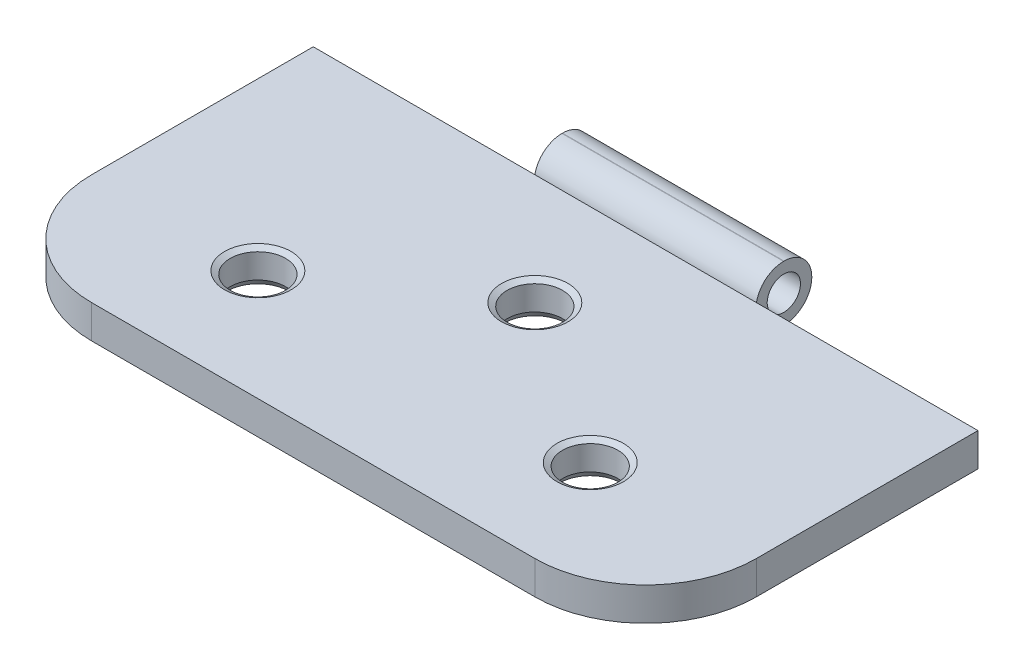
ISO-10303-21;
HEADER;
FILE_DESCRIPTION(('STEP AP214'),'2;1');
FILE_NAME('part.step','',(''),(''),'','','');
FILE_SCHEMA(('AUTOMOTIVE_DESIGN { 1 0 10303 214 1 1 1 1 }'));
ENDSEC;
DATA;
#1=APPLICATION_CONTEXT('core data for automotive mechanical design processes');
#2=APPLICATION_PROTOCOL_DEFINITION('international standard','automotive_design',2000,#1);
#3=PRODUCT_CONTEXT('',#1,'mechanical');
#4=PRODUCT('Part','Part','',(#3));
#5=PRODUCT_RELATED_PRODUCT_CATEGORY('part','',(#4));
#6=PRODUCT_DEFINITION_FORMATION('','',#4);
#7=PRODUCT_DEFINITION_CONTEXT('part definition',#1,'design');
#8=PRODUCT_DEFINITION('design','',#6,#7);
#9=PRODUCT_DEFINITION_SHAPE('','',#8);
#10=(LENGTH_UNIT() NAMED_UNIT(*) SI_UNIT(.MILLI.,.METRE.));
#11=(NAMED_UNIT(*) PLANE_ANGLE_UNIT() SI_UNIT($,.RADIAN.));
#12=(NAMED_UNIT(*) SI_UNIT($,.STERADIAN.) SOLID_ANGLE_UNIT());
#13=UNCERTAINTY_MEASURE_WITH_UNIT(LENGTH_MEASURE(1.E-05),#10,'distance_accuracy_value','');
#14=(GEOMETRIC_REPRESENTATION_CONTEXT(3) GLOBAL_UNCERTAINTY_ASSIGNED_CONTEXT((#13)) GLOBAL_UNIT_ASSIGNED_CONTEXT((#10,
#11,#12)) REPRESENTATION_CONTEXT('',''));
#15=CARTESIAN_POINT('',(0.,0.,0.));
#16=DIRECTION('',(0.,0.,1.));
#17=DIRECTION('',(1.,0.,0.));
#18=AXIS2_PLACEMENT_3D('',#15,#16,#17);
#19=CARTESIAN_POINT('',(-30.,3.,-15.));
#20=DIRECTION('',(0.,0.,1.));
#21=DIRECTION('',(1.,0.,0.));
#22=AXIS2_PLACEMENT_3D('',#19,#20,#21);
#23=PLANE('',#22);
#24=DIRECTION('',(0.,-1.,0.));
#25=VECTOR('',#24,1.);
#26=CARTESIAN_POINT('',(10.,0.,-15.));
#27=LINE('',#26,#25);
#28=CARTESIAN_POINT('',(10.,3.,-15.));
#29=VERTEX_POINT('',#28);
#30=CARTESIAN_POINT('',(9.99999999999999,0.,-15.));
#31=VERTEX_POINT('',#30);
#32=EDGE_CURVE('E126',#29,#31,#27,.T.);
#33=ORIENTED_EDGE('',*,*,#32,.F.);
#34=DIRECTION('',(-1.,0.,0.));
#35=VECTOR('',#34,1.);
#36=CARTESIAN_POINT('',(-30.,3.,-15.));
#37=LINE('',#36,#35);
#38=CARTESIAN_POINT('',(30.,3.,-15.));
#39=VERTEX_POINT('',#38);
#40=EDGE_CURVE('E132',#39,#29,#37,.T.);
#41=ORIENTED_EDGE('',*,*,#40,.F.);
#42=DIRECTION('',(0.,-1.,0.));
#43=VECTOR('',#42,1.);
#44=CARTESIAN_POINT('',(30.,3.,-15.));
#45=LINE('',#44,#43);
#46=CARTESIAN_POINT('',(30.,0.,-15.));
#47=VERTEX_POINT('',#46);
#48=EDGE_CURVE('E186',#39,#47,#45,.T.);
#49=ORIENTED_EDGE('',*,*,#48,.T.);
#50=DIRECTION('',(-1.,0.,0.));
#51=VECTOR('',#50,1.);
#52=CARTESIAN_POINT('',(-30.,0.,-15.));
#53=LINE('',#52,#51);
#54=EDGE_CURVE('E146',#47,#31,#53,.T.);
#55=ORIENTED_EDGE('',*,*,#54,.T.);
#56=EDGE_LOOP('',(#33,#41,#49,#55));
#57=FACE_BOUND('',#56,.T.);
#58=ADVANCED_FACE('F33',(#57),#23,.F.);
#59=DIRECTION('',(0.,1.,0.));
#60=VECTOR('',#59,1.);
#61=CARTESIAN_POINT('',(-9.99999999999999,0.,-15.));
#62=LINE('',#61,#60);
#63=CARTESIAN_POINT('',(-10.,0.,-15.));
#64=VERTEX_POINT('',#63);
#65=CARTESIAN_POINT('',(-9.99999999999999,3.,-15.));
#66=VERTEX_POINT('',#65);
#67=EDGE_CURVE('E147',#64,#66,#62,.T.);
#68=ORIENTED_EDGE('',*,*,#67,.F.);
#69=CARTESIAN_POINT('',(-30.,0.,-15.));
#70=VERTEX_POINT('',#69);
#71=EDGE_CURVE('E177',#64,#70,#53,.T.);
#72=ORIENTED_EDGE('',*,*,#71,.T.);
#73=DIRECTION('',(0.,-1.,0.));
#74=VECTOR('',#73,1.);
#75=CARTESIAN_POINT('',(-30.,3.,-15.));
#76=LINE('',#75,#74);
#77=CARTESIAN_POINT('',(-30.,3.,-15.));
#78=VERTEX_POINT('',#77);
#79=EDGE_CURVE('E175',#78,#70,#76,.T.);
#80=ORIENTED_EDGE('',*,*,#79,.F.);
#81=EDGE_CURVE('E142',#66,#78,#37,.T.);
#82=ORIENTED_EDGE('',*,*,#81,.F.);
#83=EDGE_LOOP('',(#68,#72,#80,#82));
#84=FACE_BOUND('',#83,.T.);
#85=ADVANCED_FACE('F278',(#84),#23,.F.);
#86=CARTESIAN_POINT('',(30.,3.,-15.));
#87=DIRECTION('',(-1.,0.,0.));
#88=DIRECTION('',(0.,0.,1.));
#89=AXIS2_PLACEMENT_3D('',#86,#87,#88);
#90=PLANE('',#89);
#91=DIRECTION('',(0.,0.,-1.));
#92=VECTOR('',#91,1.);
#93=CARTESIAN_POINT('',(30.,3.,-15.));
#94=LINE('',#93,#92);
#95=CARTESIAN_POINT('',(30.,3.,5.));
#96=VERTEX_POINT('',#95);
#97=EDGE_CURVE('E137',#96,#39,#94,.T.);
#98=ORIENTED_EDGE('',*,*,#97,.F.);
#99=DIRECTION('',(0.,-1.,0.));
#100=VECTOR('',#99,1.);
#101=CARTESIAN_POINT('',(30.,3.,5.));
#102=LINE('',#101,#100);
#103=CARTESIAN_POINT('',(30.,0.,5.));
#104=VERTEX_POINT('',#103);
#105=EDGE_CURVE('E203',#96,#104,#102,.T.);
#106=ORIENTED_EDGE('',*,*,#105,.T.);
#107=DIRECTION('',(0.,0.,-1.));
#108=VECTOR('',#107,1.);
#109=CARTESIAN_POINT('',(30.,0.,-15.));
#110=LINE('',#109,#108);
#111=EDGE_CURVE('E167',#104,#47,#110,.T.);
#112=ORIENTED_EDGE('',*,*,#111,.T.);
#113=ORIENTED_EDGE('',*,*,#48,.F.);
#114=EDGE_LOOP('',(#98,#106,#112,#113));
#115=FACE_BOUND('',#114,.T.);
#116=ADVANCED_FACE('F284',(#115),#90,.F.);
#117=CARTESIAN_POINT('',(-30.,3.,-15.));
#118=DIRECTION('',(1.,0.,0.));
#119=DIRECTION('',(0.,0.,-1.));
#120=AXIS2_PLACEMENT_3D('',#117,#118,#119);
#121=PLANE('',#120);
#122=DIRECTION('',(0.,0.,1.));
#123=VECTOR('',#122,1.);
#124=CARTESIAN_POINT('',(-30.,0.,-15.));
#125=LINE('',#124,#123);
#126=CARTESIAN_POINT('',(-30.,0.,5.));
#127=VERTEX_POINT('',#126);
#128=EDGE_CURVE('E179',#70,#127,#125,.T.);
#129=ORIENTED_EDGE('',*,*,#128,.T.);
#130=DIRECTION('',(0.,-1.,0.));
#131=VECTOR('',#130,1.);
#132=CARTESIAN_POINT('',(-30.,3.,5.));
#133=LINE('',#132,#131);
#134=CARTESIAN_POINT('',(-30.,3.,5.));
#135=VERTEX_POINT('',#134);
#136=EDGE_CURVE('E197',#127,#135,#133,.F.);
#137=ORIENTED_EDGE('',*,*,#136,.T.);
#138=DIRECTION('',(0.,0.,1.));
#139=VECTOR('',#138,1.);
#140=CARTESIAN_POINT('',(-30.,3.,-15.));
#141=LINE('',#140,#139);
#142=EDGE_CURVE('E141',#78,#135,#141,.T.);
#143=ORIENTED_EDGE('',*,*,#142,.F.);
#144=ORIENTED_EDGE('',*,*,#79,.T.);
#145=EDGE_LOOP('',(#129,#137,#143,#144));
#146=FACE_BOUND('',#145,.T.);
#147=ADVANCED_FACE('F288',(#146),#121,.F.);
#148=CARTESIAN_POINT('',(-30.,3.,15.));
#149=DIRECTION('',(0.,0.,-1.));
#150=DIRECTION('',(-1.,0.,0.));
#151=AXIS2_PLACEMENT_3D('',#148,#149,#150);
#152=PLANE('',#151);
#153=DIRECTION('',(1.,0.,0.));
#154=VECTOR('',#153,1.);
#155=CARTESIAN_POINT('',(-30.,3.,15.));
#156=LINE('',#155,#154);
#157=CARTESIAN_POINT('',(-20.,3.,15.));
#158=VERTEX_POINT('',#157);
#159=CARTESIAN_POINT('',(20.,3.,15.));
#160=VERTEX_POINT('',#159);
#161=EDGE_CURVE('E172',#158,#160,#156,.T.);
#162=ORIENTED_EDGE('',*,*,#161,.F.);
#163=DIRECTION('',(0.,-1.,0.));
#164=VECTOR('',#163,1.);
#165=CARTESIAN_POINT('',(-20.,3.,15.));
#166=LINE('',#165,#164);
#167=CARTESIAN_POINT('',(-20.,0.,15.));
#168=VERTEX_POINT('',#167);
#169=EDGE_CURVE('E190',#158,#168,#166,.T.);
#170=ORIENTED_EDGE('',*,*,#169,.T.);
#171=DIRECTION('',(1.,0.,0.));
#172=VECTOR('',#171,1.);
#173=CARTESIAN_POINT('',(-30.,0.,15.));
#174=LINE('',#173,#172);
#175=CARTESIAN_POINT('',(20.,0.,15.));
#176=VERTEX_POINT('',#175);
#177=EDGE_CURVE('E168',#168,#176,#174,.T.);
#178=ORIENTED_EDGE('',*,*,#177,.T.);
#179=DIRECTION('',(0.,-1.,0.));
#180=VECTOR('',#179,1.);
#181=CARTESIAN_POINT('',(20.,3.,15.));
#182=LINE('',#181,#180);
#183=EDGE_CURVE('E188',#176,#160,#182,.F.);
#184=ORIENTED_EDGE('',*,*,#183,.T.);
#185=EDGE_LOOP('',(#162,#170,#178,#184));
#186=FACE_BOUND('',#185,.T.);
#187=ADVANCED_FACE('F334',(#186),#152,.F.);
#188=CARTESIAN_POINT('',(0.,3.,0.));
#189=DIRECTION('',(0.,1.,0.));
#190=DIRECTION('',(0.,0.,1.));
#191=AXIS2_PLACEMENT_3D('',#188,#189,#190);
#192=PLANE('',#191);
#193=CARTESIAN_POINT('',(15.,3.,5.));
#194=DIRECTION('',(0.,1.,0.));
#195=DIRECTION('',(0.,0.,1.));
#196=AXIS2_PLACEMENT_3D('',#193,#194,#195);
#197=CIRCLE('',#196,3.00000000000002);
#198=CARTESIAN_POINT('',(15.,3.,8.00000000000001));
#199=VERTEX_POINT('',#198);
#200=EDGE_CURVE('E11',#199,#199,#197,.F.);
#201=ORIENTED_EDGE('',*,*,#200,.T.);
#202=EDGE_LOOP('',(#201));
#203=FACE_BOUND('',#202,.T.);
#204=CARTESIAN_POINT('',(-15.,3.,5.));
#205=DIRECTION('',(0.,1.,0.));
#206=DIRECTION('',(0.,0.,1.));
#207=AXIS2_PLACEMENT_3D('',#204,#205,#206);
#208=CIRCLE('',#207,3.00000000000002);
#209=CARTESIAN_POINT('',(-15.,3.,8.00000000000001));
#210=VERTEX_POINT('',#209);
#211=EDGE_CURVE('E41',#210,#210,#208,.F.);
#212=ORIENTED_EDGE('',*,*,#211,.T.);
#213=EDGE_LOOP('',(#212));
#214=FACE_BOUND('',#213,.T.);
#215=CARTESIAN_POINT('',(0.,3.,-5.));
#216=DIRECTION('',(0.,1.,0.));
#217=DIRECTION('',(0.,0.,1.));
#218=AXIS2_PLACEMENT_3D('',#215,#216,#217);
#219=CIRCLE('',#218,3.00000000000002);
#220=CARTESIAN_POINT('',(0.,3.,-1.99999999999999));
#221=VERTEX_POINT('',#220);
#222=EDGE_CURVE('E223',#221,#221,#219,.F.);
#223=ORIENTED_EDGE('',*,*,#222,.T.);
#224=EDGE_LOOP('',(#223));
#225=FACE_BOUND('',#224,.T.);
#226=DIRECTION('',(1.,0.,0.));
#227=VECTOR('',#226,1.);
#228=CARTESIAN_POINT('',(10.,3.,-15.));
#229=LINE('',#228,#227);
#230=EDGE_CURVE('E134',#66,#29,#229,.T.);
#231=ORIENTED_EDGE('',*,*,#230,.F.);
#232=ORIENTED_EDGE('',*,*,#81,.T.);
#233=ORIENTED_EDGE('',*,*,#142,.T.);
#234=CARTESIAN_POINT('',(-20.,3.,5.));
#235=DIRECTION('',(0.,1.,0.));
#236=DIRECTION('',(0.,0.,1.));
#237=AXIS2_PLACEMENT_3D('',#234,#235,#236);
#238=CIRCLE('',#237,10.);
#239=EDGE_CURVE('E201',#135,#158,#238,.T.);
#240=ORIENTED_EDGE('',*,*,#239,.T.);
#241=ORIENTED_EDGE('',*,*,#161,.T.);
#242=CARTESIAN_POINT('',(20.,3.,5.));
#243=DIRECTION('',(0.,1.,0.));
#244=DIRECTION('',(0.,0.,1.));
#245=AXIS2_PLACEMENT_3D('',#242,#243,#244);
#246=CIRCLE('',#245,10.);
#247=EDGE_CURVE('E199',#160,#96,#246,.T.);
#248=ORIENTED_EDGE('',*,*,#247,.T.);
#249=ORIENTED_EDGE('',*,*,#97,.T.);
#250=ORIENTED_EDGE('',*,*,#40,.T.);
#251=EDGE_LOOP('',(#231,#232,#233,#240,#241,#248,#249,#250));
#252=FACE_BOUND('',#251,.T.);
#253=ADVANCED_FACE('F133',(#203,#214,#225,#252),#192,.T.);
#254=CARTESIAN_POINT('',(0.,0.,0.));
#255=DIRECTION('',(0.,1.,0.));
#256=DIRECTION('',(0.,0.,1.));
#257=AXIS2_PLACEMENT_3D('',#254,#255,#256);
#258=PLANE('',#257);
#259=CARTESIAN_POINT('',(15.,0.,5.));
#260=DIRECTION('',(0.,1.,0.));
#261=DIRECTION('',(0.,0.,1.));
#262=AXIS2_PLACEMENT_3D('',#259,#260,#261);
#263=CIRCLE('',#262,2.78867513459482);
#264=CARTESIAN_POINT('',(15.,0.,7.78867513459482));
#265=VERTEX_POINT('',#264);
#266=EDGE_CURVE('E232',#265,#265,#263,.T.);
#267=ORIENTED_EDGE('',*,*,#266,.T.);
#268=EDGE_LOOP('',(#267));
#269=FACE_BOUND('',#268,.T.);
#270=CARTESIAN_POINT('',(0.,0.,-5.));
#271=DIRECTION('',(0.,1.,0.));
#272=DIRECTION('',(0.,0.,1.));
#273=AXIS2_PLACEMENT_3D('',#270,#271,#272);
#274=CIRCLE('',#273,2.78867513459482);
#275=CARTESIAN_POINT('',(0.,0.,-2.21132486540519));
#276=VERTEX_POINT('',#275);
#277=EDGE_CURVE('E229',#276,#276,#274,.T.);
#278=ORIENTED_EDGE('',*,*,#277,.T.);
#279=EDGE_LOOP('',(#278));
#280=FACE_BOUND('',#279,.T.);
#281=CARTESIAN_POINT('',(-15.,0.,5.));
#282=DIRECTION('',(0.,1.,0.));
#283=DIRECTION('',(0.,0.,1.));
#284=AXIS2_PLACEMENT_3D('',#281,#282,#283);
#285=CIRCLE('',#284,2.78867513459482);
#286=CARTESIAN_POINT('',(-15.,0.,7.78867513459482));
#287=VERTEX_POINT('',#286);
#288=EDGE_CURVE('E226',#287,#287,#285,.T.);
#289=ORIENTED_EDGE('',*,*,#288,.T.);
#290=EDGE_LOOP('',(#289));
#291=FACE_BOUND('',#290,.T.);
#292=DIRECTION('',(0.,0.,1.));
#293=VECTOR('',#292,1.);
#294=CARTESIAN_POINT('',(-9.99999999999999,0.,-20.));
#295=LINE('',#294,#293);
#296=CARTESIAN_POINT('',(-9.99999999999999,0.,-17.5));
#297=VERTEX_POINT('',#296);
#298=EDGE_CURVE('E163',#297,#64,#295,.T.);
#299=ORIENTED_EDGE('',*,*,#298,.F.);
#300=DIRECTION('',(-1.,0.,0.));
#301=VECTOR('',#300,1.);
#302=CARTESIAN_POINT('',(0.,0.,-17.5));
#303=LINE('',#302,#301);
#304=CARTESIAN_POINT('',(10.,0.,-17.5));
#305=VERTEX_POINT('',#304);
#306=EDGE_CURVE('E128',#297,#305,#303,.F.);
#307=ORIENTED_EDGE('',*,*,#306,.T.);
#308=DIRECTION('',(0.,0.,1.));
#309=VECTOR('',#308,1.);
#310=CARTESIAN_POINT('',(10.,0.,-20.));
#311=LINE('',#310,#309);
#312=EDGE_CURVE('E165',#305,#31,#311,.T.);
#313=ORIENTED_EDGE('',*,*,#312,.T.);
#314=ORIENTED_EDGE('',*,*,#54,.F.);
#315=ORIENTED_EDGE('',*,*,#111,.F.);
#316=CARTESIAN_POINT('',(20.,0.,5.));
#317=DIRECTION('',(0.,1.,0.));
#318=DIRECTION('',(0.,0.,1.));
#319=AXIS2_PLACEMENT_3D('',#316,#317,#318);
#320=CIRCLE('',#319,10.);
#321=EDGE_CURVE('E193',#104,#176,#320,.F.);
#322=ORIENTED_EDGE('',*,*,#321,.T.);
#323=ORIENTED_EDGE('',*,*,#177,.F.);
#324=CARTESIAN_POINT('',(-20.,0.,5.));
#325=DIRECTION('',(0.,1.,0.));
#326=DIRECTION('',(0.,0.,1.));
#327=AXIS2_PLACEMENT_3D('',#324,#325,#326);
#328=CIRCLE('',#327,10.);
#329=EDGE_CURVE('E195',#168,#127,#328,.F.);
#330=ORIENTED_EDGE('',*,*,#329,.T.);
#331=ORIENTED_EDGE('',*,*,#128,.F.);
#332=ORIENTED_EDGE('',*,*,#71,.F.);
#333=EDGE_LOOP('',(#299,#307,#313,#314,#315,#322,#323,#330,#331,#332));
#334=FACE_BOUND('',#333,.T.);
#335=ADVANCED_FACE('F333',(#269,#280,#291,#334),#258,.F.);
#336=CARTESIAN_POINT('',(0.,-2.,-5.));
#337=DIRECTION('',(0.,1.,0.));
#338=DIRECTION('',(0.,0.,1.));
#339=AXIS2_PLACEMENT_3D('',#336,#337,#338);
#340=CYLINDRICAL_SURFACE('',#339,2.5);
#341=CARTESIAN_POINT('',(0.,0.500000000000004,-5.));
#342=DIRECTION('',(0.,1.,0.));
#343=DIRECTION('',(0.,0.,1.));
#344=AXIS2_PLACEMENT_3D('',#341,#342,#343);
#345=CIRCLE('',#344,2.5);
#346=CARTESIAN_POINT('',(0.,0.500000000000004,-2.5));
#347=VERTEX_POINT('',#346);
#348=EDGE_CURVE('E241',#347,#347,#345,.F.);
#349=ORIENTED_EDGE('',*,*,#348,.T.);
#350=EDGE_LOOP('',(#349));
#351=FACE_BOUND('',#350,.T.);
#352=CARTESIAN_POINT('',(0.,2.71132486540518,-5.));
#353=DIRECTION('',(0.,1.,0.));
#354=DIRECTION('',(0.,0.,1.));
#355=AXIS2_PLACEMENT_3D('',#352,#353,#354);
#356=CIRCLE('',#355,2.5);
#357=CARTESIAN_POINT('',(0.,2.71132486540518,-2.5));
#358=VERTEX_POINT('',#357);
#359=EDGE_CURVE('E219',#358,#358,#356,.T.);
#360=ORIENTED_EDGE('',*,*,#359,.T.);
#361=EDGE_LOOP('',(#360));
#362=FACE_BOUND('',#361,.T.);
#363=ADVANCED_FACE('F273',(#351,#362),#340,.F.);
#364=CARTESIAN_POINT('',(15.,-2.,5.));
#365=DIRECTION('',(0.,1.,0.));
#366=DIRECTION('',(0.,0.,1.));
#367=AXIS2_PLACEMENT_3D('',#364,#365,#366);
#368=CYLINDRICAL_SURFACE('',#367,2.5);
#369=CARTESIAN_POINT('',(15.,0.500000000000004,5.));
#370=DIRECTION('',(0.,1.,0.));
#371=DIRECTION('',(0.,0.,1.));
#372=AXIS2_PLACEMENT_3D('',#369,#370,#371);
#373=CIRCLE('',#372,2.5);
#374=CARTESIAN_POINT('',(15.,0.500000000000004,7.5));
#375=VERTEX_POINT('',#374);
#376=EDGE_CURVE('E238',#375,#375,#373,.F.);
#377=ORIENTED_EDGE('',*,*,#376,.T.);
#378=EDGE_LOOP('',(#377));
#379=FACE_BOUND('',#378,.T.);
#380=CARTESIAN_POINT('',(15.,2.71132486540518,5.));
#381=DIRECTION('',(0.,1.,0.));
#382=DIRECTION('',(0.,0.,1.));
#383=AXIS2_PLACEMENT_3D('',#380,#381,#382);
#384=CIRCLE('',#383,2.5);
#385=CARTESIAN_POINT('',(15.,2.71132486540518,7.5));
#386=VERTEX_POINT('',#385);
#387=EDGE_CURVE('E235',#386,#386,#384,.T.);
#388=ORIENTED_EDGE('',*,*,#387,.T.);
#389=EDGE_LOOP('',(#388));
#390=FACE_BOUND('',#389,.T.);
#391=ADVANCED_FACE('F262',(#379,#390),#368,.F.);
#392=CARTESIAN_POINT('',(-15.,-2.,5.));
#393=DIRECTION('',(0.,1.,0.));
#394=DIRECTION('',(0.,0.,1.));
#395=AXIS2_PLACEMENT_3D('',#392,#393,#394);
#396=CYLINDRICAL_SURFACE('',#395,2.5);
#397=CARTESIAN_POINT('',(-15.,0.500000000000004,5.));
#398=DIRECTION('',(0.,1.,0.));
#399=DIRECTION('',(0.,0.,1.));
#400=AXIS2_PLACEMENT_3D('',#397,#398,#399);
#401=CIRCLE('',#400,2.5);
#402=CARTESIAN_POINT('',(-15.,0.500000000000004,7.5));
#403=VERTEX_POINT('',#402);
#404=EDGE_CURVE('E247',#403,#403,#401,.F.);
#405=ORIENTED_EDGE('',*,*,#404,.T.);
#406=EDGE_LOOP('',(#405));
#407=FACE_BOUND('',#406,.T.);
#408=CARTESIAN_POINT('',(-15.,2.71132486540518,5.));
#409=DIRECTION('',(0.,1.,0.));
#410=DIRECTION('',(0.,0.,1.));
#411=AXIS2_PLACEMENT_3D('',#408,#409,#410);
#412=CIRCLE('',#411,2.5);
#413=CARTESIAN_POINT('',(-15.,2.71132486540518,7.5));
#414=VERTEX_POINT('',#413);
#415=EDGE_CURVE('E244',#414,#414,#412,.T.);
#416=ORIENTED_EDGE('',*,*,#415,.T.);
#417=EDGE_LOOP('',(#416));
#418=FACE_BOUND('',#417,.T.);
#419=ADVANCED_FACE('F259',(#407,#418),#396,.F.);
#420=CARTESIAN_POINT('',(-20.,3.,5.));
#421=DIRECTION('',(0.,-1.,0.));
#422=DIRECTION('',(0.,0.,-1.));
#423=AXIS2_PLACEMENT_3D('',#420,#421,#422);
#424=CYLINDRICAL_SURFACE('',#423,10.);
#425=ORIENTED_EDGE('',*,*,#239,.F.);
#426=ORIENTED_EDGE('',*,*,#136,.F.);
#427=ORIENTED_EDGE('',*,*,#329,.F.);
#428=ORIENTED_EDGE('',*,*,#169,.F.);
#429=EDGE_LOOP('',(#425,#426,#427,#428));
#430=FACE_BOUND('',#429,.T.);
#431=ADVANCED_FACE('F261',(#430),#424,.T.);
#432=CARTESIAN_POINT('',(20.,3.,5.));
#433=DIRECTION('',(0.,-1.,0.));
#434=DIRECTION('',(0.,0.,-1.));
#435=AXIS2_PLACEMENT_3D('',#432,#433,#434);
#436=CYLINDRICAL_SURFACE('',#435,10.);
#437=ORIENTED_EDGE('',*,*,#247,.F.);
#438=ORIENTED_EDGE('',*,*,#183,.F.);
#439=ORIENTED_EDGE('',*,*,#321,.F.);
#440=ORIENTED_EDGE('',*,*,#105,.F.);
#441=EDGE_LOOP('',(#437,#438,#439,#440));
#442=FACE_BOUND('',#441,.T.);
#443=ADVANCED_FACE('F270',(#442),#436,.T.);
#444=CARTESIAN_POINT('',(10.,0.,-20.));
#445=DIRECTION('',(-1.,0.,0.));
#446=DIRECTION('',(0.,0.,1.));
#447=AXIS2_PLACEMENT_3D('',#444,#445,#446);
#448=PLANE('',#447);
#449=CARTESIAN_POINT('',(10.,2.5,-17.4747448713916));
#450=DIRECTION('',(1.,0.,0.));
#451=DIRECTION('',(0.,0.,-1.));
#452=AXIS2_PLACEMENT_3D('',#449,#450,#451);
#453=CIRCLE('',#452,1.5);
#454=CARTESIAN_POINT('',(10.,2.5,-18.9747448713916));
#455=VERTEX_POINT('',#454);
#456=EDGE_CURVE('E550',#455,#455,#453,.T.);
#457=ORIENTED_EDGE('',*,*,#456,.F.);
#458=EDGE_LOOP('',(#457));
#459=FACE_BOUND('',#458,.T.);
#460=ORIENTED_EDGE('',*,*,#312,.F.);
#461=CARTESIAN_POINT('',(10.,2.5,-17.5));
#462=DIRECTION('',(-1.,0.,0.));
#463=DIRECTION('',(0.,0.,1.));
#464=AXIS2_PLACEMENT_3D('',#461,#462,#463);
#465=CIRCLE('',#464,2.5);
#466=CARTESIAN_POINT('',(10.,2.5,-20.));
#467=VERTEX_POINT('',#466);
#468=EDGE_CURVE('E214',#305,#467,#465,.F.);
#469=ORIENTED_EDGE('',*,*,#468,.T.);
#470=CARTESIAN_POINT('',(10.,2.5,-17.5));
#471=DIRECTION('',(-1.,0.,0.));
#472=DIRECTION('',(0.,0.,1.));
#473=AXIS2_PLACEMENT_3D('',#470,#471,#472);
#474=CIRCLE('',#473,2.5);
#475=CARTESIAN_POINT('',(10.,5.,-17.5));
#476=VERTEX_POINT('',#475);
#477=EDGE_CURVE('E48',#467,#476,#474,.F.);
#478=ORIENTED_EDGE('',*,*,#477,.T.);
#479=DIRECTION('',(0.,0.,-1.));
#480=VECTOR('',#479,1.);
#481=CARTESIAN_POINT('',(10.,5.,-20.));
#482=LINE('',#481,#480);
#483=CARTESIAN_POINT('',(10.,5.,-17.4494897427832));
#484=VERTEX_POINT('',#483);
#485=EDGE_CURVE('E127',#484,#476,#482,.T.);
#486=ORIENTED_EDGE('',*,*,#485,.F.);
#487=CARTESIAN_POINT('',(10.,2.5,-17.4494897427832));
#488=DIRECTION('',(-1.,0.,0.));
#489=DIRECTION('',(0.,0.,1.));
#490=AXIS2_PLACEMENT_3D('',#487,#488,#489);
#491=CIRCLE('',#490,2.5);
#492=EDGE_CURVE('E56',#484,#29,#491,.F.);
#493=ORIENTED_EDGE('',*,*,#492,.T.);
#494=ORIENTED_EDGE('',*,*,#32,.T.);
#495=EDGE_LOOP('',(#460,#469,#478,#486,#493,#494));
#496=FACE_BOUND('',#495,.T.);
#497=ADVANCED_FACE('F124',(#459,#496),#448,.F.);
#498=CARTESIAN_POINT('',(-9.99999999999999,0.,-20.));
#499=DIRECTION('',(1.,0.,0.));
#500=DIRECTION('',(0.,0.,-1.));
#501=AXIS2_PLACEMENT_3D('',#498,#499,#500);
#502=PLANE('',#501);
#503=CARTESIAN_POINT('',(-9.99999999999999,2.5,-17.4747448713916));
#504=DIRECTION('',(1.,0.,0.));
#505=DIRECTION('',(0.,0.,-1.));
#506=AXIS2_PLACEMENT_3D('',#503,#504,#505);
#507=CIRCLE('',#506,1.5);
#508=CARTESIAN_POINT('',(-9.99999999999999,2.5,-18.9747448713916));
#509=VERTEX_POINT('',#508);
#510=EDGE_CURVE('E157',#509,#509,#507,.T.);
#511=ORIENTED_EDGE('',*,*,#510,.T.);
#512=EDGE_LOOP('',(#511));
#513=FACE_BOUND('',#512,.T.);
#514=CARTESIAN_POINT('',(-9.99999999999999,2.5,-17.5));
#515=DIRECTION('',(1.,0.,0.));
#516=DIRECTION('',(0.,0.,-1.));
#517=AXIS2_PLACEMENT_3D('',#514,#515,#516);
#518=CIRCLE('',#517,2.5);
#519=CARTESIAN_POINT('',(-9.99999999999999,5.,-17.5));
#520=VERTEX_POINT('',#519);
#521=CARTESIAN_POINT('',(-9.99999999999999,2.5,-20.));
#522=VERTEX_POINT('',#521);
#523=EDGE_CURVE('E207',#520,#522,#518,.F.);
#524=ORIENTED_EDGE('',*,*,#523,.T.);
#525=CARTESIAN_POINT('',(-9.99999999999999,2.5,-17.5));
#526=DIRECTION('',(1.,0.,0.));
#527=DIRECTION('',(0.,0.,-1.));
#528=AXIS2_PLACEMENT_3D('',#525,#526,#527);
#529=CIRCLE('',#528,2.5);
#530=EDGE_CURVE('E209',#522,#297,#529,.F.);
#531=ORIENTED_EDGE('',*,*,#530,.T.);
#532=ORIENTED_EDGE('',*,*,#298,.T.);
#533=ORIENTED_EDGE('',*,*,#67,.T.);
#534=CARTESIAN_POINT('',(-9.99999999999999,2.5,-17.4494897427832));
#535=DIRECTION('',(1.,0.,0.));
#536=DIRECTION('',(0.,0.,-1.));
#537=AXIS2_PLACEMENT_3D('',#534,#535,#536);
#538=CIRCLE('',#537,2.5);
#539=CARTESIAN_POINT('',(-9.99999999999999,5.,-17.4494897427832));
#540=VERTEX_POINT('',#539);
#541=EDGE_CURVE('E152',#66,#540,#538,.F.);
#542=ORIENTED_EDGE('',*,*,#541,.T.);
#543=DIRECTION('',(0.,0.,1.));
#544=VECTOR('',#543,1.);
#545=CARTESIAN_POINT('',(-9.99999999999999,5.,-20.));
#546=LINE('',#545,#544);
#547=EDGE_CURVE('E148',#520,#540,#546,.T.);
#548=ORIENTED_EDGE('',*,*,#547,.F.);
#549=EDGE_LOOP('',(#524,#531,#532,#533,#542,#548));
#550=FACE_BOUND('',#549,.T.);
#551=ADVANCED_FACE('F372',(#513,#550),#502,.F.);
#552=CARTESIAN_POINT('',(0.,5.,0.));
#553=DIRECTION('',(0.,-1.,0.));
#554=DIRECTION('',(0.,0.,-1.));
#555=AXIS2_PLACEMENT_3D('',#552,#553,#554);
#556=PLANE('',#555);
#557=ORIENTED_EDGE('',*,*,#485,.T.);
#558=DIRECTION('',(-1.,0.,0.));
#559=VECTOR('',#558,1.);
#560=CARTESIAN_POINT('',(0.,5.,-17.5));
#561=LINE('',#560,#559);
#562=EDGE_CURVE('E218',#476,#520,#561,.T.);
#563=ORIENTED_EDGE('',*,*,#562,.T.);
#564=ORIENTED_EDGE('',*,*,#547,.T.);
#565=DIRECTION('',(1.,0.,0.));
#566=VECTOR('',#565,1.);
#567=CARTESIAN_POINT('',(0.,5.,-17.4494897427832));
#568=LINE('',#567,#566);
#569=EDGE_CURVE('E216',#540,#484,#568,.T.);
#570=ORIENTED_EDGE('',*,*,#569,.T.);
#571=EDGE_LOOP('',(#557,#563,#564,#570));
#572=FACE_BOUND('',#571,.T.);
#573=ADVANCED_FACE('F303',(#572),#556,.F.);
#574=CARTESIAN_POINT('',(0.,2.5,-17.5));
#575=DIRECTION('',(-1.,0.,0.));
#576=DIRECTION('',(0.,0.,1.));
#577=AXIS2_PLACEMENT_3D('',#574,#575,#576);
#578=CYLINDRICAL_SURFACE('',#577,2.5);
#579=ORIENTED_EDGE('',*,*,#562,.F.);
#580=ORIENTED_EDGE('',*,*,#477,.F.);
#581=DIRECTION('',(-1.,0.,0.));
#582=VECTOR('',#581,1.);
#583=CARTESIAN_POINT('',(0.,2.5,-20.));
#584=LINE('',#583,#582);
#585=EDGE_CURVE('E153',#522,#467,#584,.F.);
#586=ORIENTED_EDGE('',*,*,#585,.F.);
#587=ORIENTED_EDGE('',*,*,#523,.F.);
#588=EDGE_LOOP('',(#579,#580,#586,#587));
#589=FACE_BOUND('',#588,.T.);
#590=ADVANCED_FACE('F299',(#589),#578,.T.);
#591=CARTESIAN_POINT('',(0.,2.5,-17.5));
#592=DIRECTION('',(-1.,0.,0.));
#593=DIRECTION('',(0.,0.,1.));
#594=AXIS2_PLACEMENT_3D('',#591,#592,#593);
#595=CYLINDRICAL_SURFACE('',#594,2.5);
#596=ORIENTED_EDGE('',*,*,#468,.F.);
#597=ORIENTED_EDGE('',*,*,#306,.F.);
#598=ORIENTED_EDGE('',*,*,#530,.F.);
#599=ORIENTED_EDGE('',*,*,#585,.T.);
#600=EDGE_LOOP('',(#596,#597,#598,#599));
#601=FACE_BOUND('',#600,.T.);
#602=ADVANCED_FACE('F296',(#601),#595,.T.);
#603=CARTESIAN_POINT('',(10.,2.5,-17.4494897427832));
#604=DIRECTION('',(1.,0.,0.));
#605=DIRECTION('',(0.,0.,-1.));
#606=AXIS2_PLACEMENT_3D('',#603,#604,#605);
#607=CYLINDRICAL_SURFACE('',#606,2.5);
#608=ORIENTED_EDGE('',*,*,#541,.F.);
#609=ORIENTED_EDGE('',*,*,#230,.T.);
#610=ORIENTED_EDGE('',*,*,#492,.F.);
#611=ORIENTED_EDGE('',*,*,#569,.F.);
#612=EDGE_LOOP('',(#608,#609,#610,#611));
#613=FACE_BOUND('',#612,.T.);
#614=ADVANCED_FACE('F151',(#613),#607,.T.);
#615=CARTESIAN_POINT('',(-9.99999999999999,2.5,-17.4747448713916));
#616=DIRECTION('',(1.,0.,0.));
#617=DIRECTION('',(0.,0.,-1.));
#618=AXIS2_PLACEMENT_3D('',#615,#616,#617);
#619=CYLINDRICAL_SURFACE('',#618,1.5);
#620=ORIENTED_EDGE('',*,*,#510,.F.);
#621=EDGE_LOOP('',(#620));
#622=FACE_BOUND('',#621,.T.);
#623=ORIENTED_EDGE('',*,*,#456,.T.);
#624=EDGE_LOOP('',(#623));
#625=FACE_BOUND('',#624,.T.);
#626=ADVANCED_FACE('F307',(#622,#625),#619,.F.);
#627=CARTESIAN_POINT('',(0.,2.71132486540518,-5.));
#628=DIRECTION('',(0.,1.,0.));
#629=DIRECTION('',(0.,0.,1.));
#630=AXIS2_PLACEMENT_3D('',#627,#628,#629);
#631=CONICAL_SURFACE('',#630,2.5,1.0471975511966);
#632=CARTESIAN_POINT('',(0.,3.,-1.99999999999999));
#633=CARTESIAN_POINT('',(0.,2.99699296734797,-2.00520833333332));
#634=CARTESIAN_POINT('',(0.,2.99398593469594,-2.01041666666665));
#635=CARTESIAN_POINT('',(0.,2.98797186939188,-2.02083333333332));
#636=CARTESIAN_POINT('',(0.,2.98496483673985,-2.02604166666666));
#637=CARTESIAN_POINT('',(0.,2.97895077143579,-2.03645833333332));
#638=CARTESIAN_POINT('',(0.,2.97594373878376,-2.04166666666666));
#639=CARTESIAN_POINT('',(0.,2.96992967347971,-2.05208333333332));
#640=CARTESIAN_POINT('',(0.,2.96692264082768,-2.05729166666666));
#641=CARTESIAN_POINT('',(0.,2.96090857552362,-2.06770833333332));
#642=CARTESIAN_POINT('',(0.,2.95790154287159,-2.07291666666666));
#643=CARTESIAN_POINT('',(0.,2.95188747756753,-2.08333333333332));
#644=CARTESIAN_POINT('',(0.,2.9488804449155,-2.08854166666666));
#645=CARTESIAN_POINT('',(0.,2.94286637961144,-2.09895833333333));
#646=CARTESIAN_POINT('',(0.,2.93985934695941,-2.10416666666666));
#647=CARTESIAN_POINT('',(0.,2.93384528165535,-2.11458333333333));
#648=CARTESIAN_POINT('',(0.,2.93083824900332,-2.11979166666666));
#649=CARTESIAN_POINT('',(0.,2.92482418369926,-2.13020833333333));
#650=CARTESIAN_POINT('',(0.,2.92181715104724,-2.13541666666666));
#651=CARTESIAN_POINT('',(0.,2.91580308574318,-2.14583333333333));
#652=CARTESIAN_POINT('',(0.,2.91279605309115,-2.15104166666666));
#653=CARTESIAN_POINT('',(0.,2.90678198778709,-2.16145833333333));
#654=CARTESIAN_POINT('',(0.,2.90377495513506,-2.16666666666666));
#655=CARTESIAN_POINT('',(0.,2.897760889831,-2.17708333333333));
#656=CARTESIAN_POINT('',(0.,2.89475385717897,-2.18229166666666));
#657=CARTESIAN_POINT('',(0.,2.88873979187491,-2.19270833333333));
#658=CARTESIAN_POINT('',(0.,2.88573275922288,-2.19791666666666));
#659=CARTESIAN_POINT('',(0.,2.87971869391882,-2.20833333333333));
#660=CARTESIAN_POINT('',(0.,2.87671166126679,-2.21354166666666));
#661=CARTESIAN_POINT('',(0.,2.87069759596274,-2.22395833333333));
#662=CARTESIAN_POINT('',(0.,2.86769056331071,-2.22916666666666));
#663=CARTESIAN_POINT('',(0.,2.86167649800665,-2.23958333333333));
#664=CARTESIAN_POINT('',(0.,2.85866946535462,-2.24479166666666));
#665=CARTESIAN_POINT('',(0.,2.85265540005056,-2.25520833333333));
#666=CARTESIAN_POINT('',(0.,2.84964836739853,-2.26041666666666));
#667=CARTESIAN_POINT('',(0.,2.84363430209447,-2.27083333333333));
#668=CARTESIAN_POINT('',(0.,2.84062726944244,-2.27604166666666));
#669=CARTESIAN_POINT('',(0.,2.83461320413838,-2.28645833333333));
#670=CARTESIAN_POINT('',(0.,2.83160617148635,-2.29166666666666));
#671=CARTESIAN_POINT('',(0.,2.8255921061823,-2.30208333333333));
#672=CARTESIAN_POINT('',(0.,2.82258507353027,-2.30729166666666));
#673=CARTESIAN_POINT('',(0.,2.81657100822621,-2.31770833333333));
#674=CARTESIAN_POINT('',(0.,2.81356397557418,-2.32291666666667));
#675=CARTESIAN_POINT('',(0.,2.80754991027012,-2.33333333333333));
#676=CARTESIAN_POINT('',(0.,2.80454287761809,-2.33854166666667));
#677=CARTESIAN_POINT('',(0.,2.79852881231403,-2.34895833333333));
#678=CARTESIAN_POINT('',(0.,2.795521779662,-2.35416666666667));
#679=CARTESIAN_POINT('',(0.,2.78950771435794,-2.36458333333333));
#680=CARTESIAN_POINT('',(0.,2.78650068170591,-2.36979166666667));
#681=CARTESIAN_POINT('',(0.,2.78048661640185,-2.38020833333333));
#682=CARTESIAN_POINT('',(0.,2.77747958374982,-2.38541666666667));
#683=CARTESIAN_POINT('',(0.,2.77146551844577,-2.39583333333333));
#684=CARTESIAN_POINT('',(0.,2.76845848579374,-2.40104166666667));
#685=CARTESIAN_POINT('',(0.,2.76244442048968,-2.41145833333333));
#686=CARTESIAN_POINT('',(0.,2.75943738783765,-2.41666666666667));
#687=CARTESIAN_POINT('',(0.,2.75342332253359,-2.42708333333334));
#688=CARTESIAN_POINT('',(0.,2.75041628988156,-2.43229166666667));
#689=CARTESIAN_POINT('',(0.,2.7444022245775,-2.44270833333334));
#690=CARTESIAN_POINT('',(0.,2.74139519192547,-2.44791666666667));
#691=CARTESIAN_POINT('',(0.,2.73538112662141,-2.45833333333334));
#692=CARTESIAN_POINT('',(0.,2.73237409396938,-2.46354166666667));
#693=CARTESIAN_POINT('',(0.,2.72636002866532,-2.47395833333334));
#694=CARTESIAN_POINT('',(0.,2.7233529960133,-2.47916666666667));
#695=CARTESIAN_POINT('',(0.,2.71733893070924,-2.48958333333334));
#696=CARTESIAN_POINT('',(0.,2.71433189805721,-2.49479166666667));
#697=CARTESIAN_POINT('',(0.,2.71132486540518,-2.5));
#698=B_SPLINE_CURVE_WITH_KNOTS('',3,(#632,#633,#634,#635,#636,#637,#638,#639,#640,#641,#642,
#643,#644,#645,#646,#647,#648,#649,#650,#651,#652,#653,#654,#655,#656,#657,#658,#659,#660,#661,
#662,#663,#664,#665,#666,#667,#668,#669,#670,#671,#672,#673,#674,#675,#676,#677,#678,#679,#680,
#681,#682,#683,#684,#685,#686,#687,#688,#689,#690,#691,#692,#693,#694,#695,#696,#697),
.UNSPECIFIED.,.F.,.F.,(4,2,2,2,2,2,2,2,2,2,2,2,2,2,2,2,2,2,2,2,2,2,2,2,2,2,2,2,2,2,2,2,4),(0.,
0.0180421959121761,0.0360843918243525,0.0541265877365289,0.0721687836487052,0.0902109795608816,
0.108253175473058,0.126295371385235,0.144337567297411,0.162379763209587,0.180421959121764,
0.19846415503394,0.216506350946116,0.234548546858293,0.252590742770469,0.270632938682646,
0.288675134594822,0.306717330506998,0.324759526419175,0.342801722331351,0.360843918243527,
0.378886114155704,0.39692831006788,0.414970505980057,0.433012701892233,0.451054897804409,
0.469097093716586,0.487139289628762,0.505181485540938,0.523223681453115,0.541265877365291,
0.559308073277468,0.577350269189644),.UNSPECIFIED.);
#699=EDGE_CURVE('BSEAM308',#221,#358,#698,.T.);
#700=ORIENTED_EDGE('',*,*,#222,.F.);
#701=ORIENTED_EDGE('',*,*,#359,.F.);
#702=ORIENTED_EDGE('',*,*,#699,.T.);
#703=ORIENTED_EDGE('',*,*,#699,.F.);
#704=EDGE_LOOP('',(#700,#702,#701,#703));
#705=FACE_BOUND('',#704,.T.);
#706=ADVANCED_FACE('F308',(#705),#631,.F.);
#707=CARTESIAN_POINT('',(15.,0.,5.));
#708=DIRECTION('',(0.,-1.,0.));
#709=DIRECTION('',(0.,0.,-1.));
#710=AXIS2_PLACEMENT_3D('',#707,#708,#709);
#711=CONICAL_SURFACE('',#710,2.78867513459482,0.523598775598304);
#712=ORIENTED_EDGE('',*,*,#376,.F.);
#713=EDGE_LOOP('',(#712));
#714=FACE_BOUND('',#713,.T.);
#715=ORIENTED_EDGE('',*,*,#266,.F.);
#716=EDGE_LOOP('',(#715));
#717=FACE_BOUND('',#716,.T.);
#718=ADVANCED_FACE('F311',(#714,#717),#711,.F.);
#719=CARTESIAN_POINT('',(0.,0.,-5.));
#720=DIRECTION('',(0.,-1.,0.));
#721=DIRECTION('',(0.,0.,-1.));
#722=AXIS2_PLACEMENT_3D('',#719,#720,#721);
#723=CONICAL_SURFACE('',#722,2.78867513459482,0.523598775598304);
#724=ORIENTED_EDGE('',*,*,#348,.F.);
#725=EDGE_LOOP('',(#724));
#726=FACE_BOUND('',#725,.T.);
#727=ORIENTED_EDGE('',*,*,#277,.F.);
#728=EDGE_LOOP('',(#727));
#729=FACE_BOUND('',#728,.T.);
#730=ADVANCED_FACE('F315',(#726,#729),#723,.F.);
#731=CARTESIAN_POINT('',(-15.,0.,5.));
#732=DIRECTION('',(0.,-1.,0.));
#733=DIRECTION('',(0.,0.,-1.));
#734=AXIS2_PLACEMENT_3D('',#731,#732,#733);
#735=CONICAL_SURFACE('',#734,2.78867513459482,0.523598775598304);
#736=ORIENTED_EDGE('',*,*,#404,.F.);
#737=EDGE_LOOP('',(#736));
#738=FACE_BOUND('',#737,.T.);
#739=ORIENTED_EDGE('',*,*,#288,.F.);
#740=EDGE_LOOP('',(#739));
#741=FACE_BOUND('',#740,.T.);
#742=ADVANCED_FACE('F319',(#738,#741),#735,.F.);
#743=CARTESIAN_POINT('',(15.,2.71132486540518,5.));
#744=DIRECTION('',(0.,1.,0.));
#745=DIRECTION('',(0.,0.,1.));
#746=AXIS2_PLACEMENT_3D('',#743,#744,#745);
#747=CONICAL_SURFACE('',#746,2.5,1.0471975511966);
#748=CARTESIAN_POINT('',(15.,3.,8.00000000000001));
#749=CARTESIAN_POINT('',(15.,2.99699296734797,7.99479166666668));
#750=CARTESIAN_POINT('',(15.,2.99398593469594,7.98958333333335));
#751=CARTESIAN_POINT('',(15.,2.98797186939188,7.97916666666668));
#752=CARTESIAN_POINT('',(15.,2.98496483673985,7.97395833333335));
#753=CARTESIAN_POINT('',(15.,2.97895077143579,7.96354166666668));
#754=CARTESIAN_POINT('',(15.,2.97594373878376,7.95833333333334));
#755=CARTESIAN_POINT('',(15.,2.96992967347971,7.94791666666668));
#756=CARTESIAN_POINT('',(15.,2.96692264082768,7.94270833333334));
#757=CARTESIAN_POINT('',(15.,2.96090857552362,7.93229166666668));
#758=CARTESIAN_POINT('',(15.,2.95790154287159,7.92708333333334));
#759=CARTESIAN_POINT('',(15.,2.95188747756753,7.91666666666668));
#760=CARTESIAN_POINT('',(15.,2.9488804449155,7.91145833333334));
#761=CARTESIAN_POINT('',(15.,2.94286637961144,7.90104166666668));
#762=CARTESIAN_POINT('',(15.,2.93985934695941,7.89583333333334));
#763=CARTESIAN_POINT('',(15.,2.93384528165535,7.88541666666668));
#764=CARTESIAN_POINT('',(15.,2.93083824900332,7.88020833333334));
#765=CARTESIAN_POINT('',(15.,2.92482418369926,7.86979166666668));
#766=CARTESIAN_POINT('',(15.,2.92181715104724,7.86458333333334));
#767=CARTESIAN_POINT('',(15.,2.91580308574318,7.85416666666668));
#768=CARTESIAN_POINT('',(15.,2.91279605309115,7.84895833333334));
#769=CARTESIAN_POINT('',(15.,2.90678198778709,7.83854166666668));
#770=CARTESIAN_POINT('',(15.,2.90377495513506,7.83333333333334));
#771=CARTESIAN_POINT('',(15.,2.897760889831,7.82291666666667));
#772=CARTESIAN_POINT('',(15.,2.89475385717897,7.81770833333334));
#773=CARTESIAN_POINT('',(15.,2.88873979187491,7.80729166666667));
#774=CARTESIAN_POINT('',(15.,2.88573275922288,7.80208333333334));
#775=CARTESIAN_POINT('',(15.,2.87971869391882,7.79166666666667));
#776=CARTESIAN_POINT('',(15.,2.87671166126679,7.78645833333334));
#777=CARTESIAN_POINT('',(15.,2.87069759596274,7.77604166666667));
#778=CARTESIAN_POINT('',(15.,2.86769056331071,7.77083333333334));
#779=CARTESIAN_POINT('',(15.,2.86167649800665,7.76041666666667));
#780=CARTESIAN_POINT('',(15.,2.85866946535462,7.75520833333334));
#781=CARTESIAN_POINT('',(15.,2.85265540005056,7.74479166666667));
#782=CARTESIAN_POINT('',(15.,2.84964836739853,7.73958333333334));
#783=CARTESIAN_POINT('',(15.,2.84363430209447,7.72916666666667));
#784=CARTESIAN_POINT('',(15.,2.84062726944244,7.72395833333334));
#785=CARTESIAN_POINT('',(15.,2.83461320413838,7.71354166666667));
#786=CARTESIAN_POINT('',(15.,2.83160617148635,7.70833333333334));
#787=CARTESIAN_POINT('',(15.,2.8255921061823,7.69791666666667));
#788=CARTESIAN_POINT('',(15.,2.82258507353027,7.69270833333334));
#789=CARTESIAN_POINT('',(15.,2.81657100822621,7.68229166666667));
#790=CARTESIAN_POINT('',(15.,2.81356397557418,7.67708333333334));
#791=CARTESIAN_POINT('',(15.,2.80754991027012,7.66666666666667));
#792=CARTESIAN_POINT('',(15.,2.80454287761809,7.66145833333334));
#793=CARTESIAN_POINT('',(15.,2.79852881231403,7.65104166666667));
#794=CARTESIAN_POINT('',(15.,2.795521779662,7.64583333333333));
#795=CARTESIAN_POINT('',(15.,2.78950771435794,7.63541666666667));
#796=CARTESIAN_POINT('',(15.,2.78650068170591,7.63020833333333));
#797=CARTESIAN_POINT('',(15.,2.78048661640185,7.61979166666667));
#798=CARTESIAN_POINT('',(15.,2.77747958374982,7.61458333333333));
#799=CARTESIAN_POINT('',(15.,2.77146551844577,7.60416666666667));
#800=CARTESIAN_POINT('',(15.,2.76845848579374,7.59895833333333));
#801=CARTESIAN_POINT('',(15.,2.76244442048968,7.58854166666667));
#802=CARTESIAN_POINT('',(15.,2.75943738783765,7.58333333333333));
#803=CARTESIAN_POINT('',(15.,2.75342332253359,7.57291666666667));
#804=CARTESIAN_POINT('',(15.,2.75041628988156,7.56770833333333));
#805=CARTESIAN_POINT('',(15.,2.7444022245775,7.55729166666667));
#806=CARTESIAN_POINT('',(15.,2.74139519192547,7.55208333333333));
#807=CARTESIAN_POINT('',(15.,2.73538112662141,7.54166666666667));
#808=CARTESIAN_POINT('',(15.,2.73237409396938,7.53645833333333));
#809=CARTESIAN_POINT('',(15.,2.72636002866532,7.52604166666666));
#810=CARTESIAN_POINT('',(15.,2.7233529960133,7.52083333333333));
#811=CARTESIAN_POINT('',(15.,2.71733893070924,7.51041666666666));
#812=CARTESIAN_POINT('',(15.,2.71433189805721,7.50520833333333));
#813=CARTESIAN_POINT('',(15.,2.71132486540518,7.5));
#814=B_SPLINE_CURVE_WITH_KNOTS('',3,(#748,#749,#750,#751,#752,#753,#754,#755,#756,#757,#758,
#759,#760,#761,#762,#763,#764,#765,#766,#767,#768,#769,#770,#771,#772,#773,#774,#775,#776,#777,
#778,#779,#780,#781,#782,#783,#784,#785,#786,#787,#788,#789,#790,#791,#792,#793,#794,#795,#796,
#797,#798,#799,#800,#801,#802,#803,#804,#805,#806,#807,#808,#809,#810,#811,#812,#813),
.UNSPECIFIED.,.F.,.F.,(4,2,2,2,2,2,2,2,2,2,2,2,2,2,2,2,2,2,2,2,2,2,2,2,2,2,2,2,2,2,2,2,4),(0.,
0.0180421959121773,0.0360843918243533,0.0541265877365292,0.0721687836487052,0.0902109795608812,
0.108253175473059,0.126295371385235,0.144337567297411,0.162379763209588,0.180421959121764,
0.19846415503394,0.216506350946117,0.234548546858293,0.252590742770469,0.270632938682646,
0.288675134594823,0.306717330506999,0.324759526419174,0.342801722331351,0.360843918243528,
0.378886114155704,0.396928310067881,0.414970505980057,0.433012701892233,0.451054897804409,
0.469097093716586,0.487139289628763,0.505181485540939,0.523223681453115,0.541265877365292,
0.559308073277468,0.577350269189644),.UNSPECIFIED.);
#815=EDGE_CURVE('BSEAM256',#199,#386,#814,.T.);
#816=ORIENTED_EDGE('',*,*,#200,.F.);
#817=ORIENTED_EDGE('',*,*,#387,.F.);
#818=ORIENTED_EDGE('',*,*,#815,.T.);
#819=ORIENTED_EDGE('',*,*,#815,.F.);
#820=EDGE_LOOP('',(#816,#818,#817,#819));
#821=FACE_BOUND('',#820,.T.);
#822=ADVANCED_FACE('F256',(#821),#747,.F.);
#823=CARTESIAN_POINT('',(-15.,2.71132486540518,5.));
#824=DIRECTION('',(0.,1.,0.));
#825=DIRECTION('',(0.,0.,1.));
#826=AXIS2_PLACEMENT_3D('',#823,#824,#825);
#827=CONICAL_SURFACE('',#826,2.5,1.0471975511966);
#828=CARTESIAN_POINT('',(-15.,3.,8.00000000000001));
#829=CARTESIAN_POINT('',(-15.,2.99699296734797,7.99479166666668));
#830=CARTESIAN_POINT('',(-15.,2.99398593469594,7.98958333333335));
#831=CARTESIAN_POINT('',(-15.,2.98797186939188,7.97916666666668));
#832=CARTESIAN_POINT('',(-15.,2.98496483673985,7.97395833333335));
#833=CARTESIAN_POINT('',(-15.,2.97895077143579,7.96354166666668));
#834=CARTESIAN_POINT('',(-15.,2.97594373878376,7.95833333333334));
#835=CARTESIAN_POINT('',(-15.,2.96992967347971,7.94791666666668));
#836=CARTESIAN_POINT('',(-15.,2.96692264082768,7.94270833333334));
#837=CARTESIAN_POINT('',(-15.,2.96090857552362,7.93229166666668));
#838=CARTESIAN_POINT('',(-15.,2.95790154287159,7.92708333333334));
#839=CARTESIAN_POINT('',(-15.,2.95188747756753,7.91666666666668));
#840=CARTESIAN_POINT('',(-15.,2.9488804449155,7.91145833333334));
#841=CARTESIAN_POINT('',(-15.,2.94286637961144,7.90104166666668));
#842=CARTESIAN_POINT('',(-15.,2.93985934695941,7.89583333333334));
#843=CARTESIAN_POINT('',(-15.,2.93384528165535,7.88541666666668));
#844=CARTESIAN_POINT('',(-15.,2.93083824900332,7.88020833333334));
#845=CARTESIAN_POINT('',(-15.,2.92482418369926,7.86979166666668));
#846=CARTESIAN_POINT('',(-15.,2.92181715104724,7.86458333333334));
#847=CARTESIAN_POINT('',(-15.,2.91580308574318,7.85416666666668));
#848=CARTESIAN_POINT('',(-15.,2.91279605309115,7.84895833333334));
#849=CARTESIAN_POINT('',(-15.,2.90678198778709,7.83854166666668));
#850=CARTESIAN_POINT('',(-15.,2.90377495513506,7.83333333333334));
#851=CARTESIAN_POINT('',(-15.,2.897760889831,7.82291666666667));
#852=CARTESIAN_POINT('',(-15.,2.89475385717897,7.81770833333334));
#853=CARTESIAN_POINT('',(-15.,2.88873979187491,7.80729166666667));
#854=CARTESIAN_POINT('',(-15.,2.88573275922288,7.80208333333334));
#855=CARTESIAN_POINT('',(-15.,2.87971869391882,7.79166666666667));
#856=CARTESIAN_POINT('',(-15.,2.87671166126679,7.78645833333334));
#857=CARTESIAN_POINT('',(-15.,2.87069759596274,7.77604166666667));
#858=CARTESIAN_POINT('',(-15.,2.86769056331071,7.77083333333334));
#859=CARTESIAN_POINT('',(-15.,2.86167649800665,7.76041666666667));
#860=CARTESIAN_POINT('',(-15.,2.85866946535462,7.75520833333334));
#861=CARTESIAN_POINT('',(-15.,2.85265540005056,7.74479166666667));
#862=CARTESIAN_POINT('',(-15.,2.84964836739853,7.73958333333334));
#863=CARTESIAN_POINT('',(-15.,2.84363430209447,7.72916666666667));
#864=CARTESIAN_POINT('',(-15.,2.84062726944244,7.72395833333334));
#865=CARTESIAN_POINT('',(-15.,2.83461320413838,7.71354166666667));
#866=CARTESIAN_POINT('',(-15.,2.83160617148635,7.70833333333334));
#867=CARTESIAN_POINT('',(-15.,2.8255921061823,7.69791666666667));
#868=CARTESIAN_POINT('',(-15.,2.82258507353027,7.69270833333334));
#869=CARTESIAN_POINT('',(-15.,2.81657100822621,7.68229166666667));
#870=CARTESIAN_POINT('',(-15.,2.81356397557418,7.67708333333334));
#871=CARTESIAN_POINT('',(-15.,2.80754991027012,7.66666666666667));
#872=CARTESIAN_POINT('',(-15.,2.80454287761809,7.66145833333334));
#873=CARTESIAN_POINT('',(-15.,2.79852881231403,7.65104166666667));
#874=CARTESIAN_POINT('',(-15.,2.795521779662,7.64583333333333));
#875=CARTESIAN_POINT('',(-15.,2.78950771435794,7.63541666666667));
#876=CARTESIAN_POINT('',(-15.,2.78650068170591,7.63020833333333));
#877=CARTESIAN_POINT('',(-15.,2.78048661640185,7.61979166666667));
#878=CARTESIAN_POINT('',(-15.,2.77747958374982,7.61458333333333));
#879=CARTESIAN_POINT('',(-15.,2.77146551844577,7.60416666666667));
#880=CARTESIAN_POINT('',(-15.,2.76845848579374,7.59895833333333));
#881=CARTESIAN_POINT('',(-15.,2.76244442048968,7.58854166666667));
#882=CARTESIAN_POINT('',(-15.,2.75943738783765,7.58333333333333));
#883=CARTESIAN_POINT('',(-15.,2.75342332253359,7.57291666666667));
#884=CARTESIAN_POINT('',(-15.,2.75041628988156,7.56770833333333));
#885=CARTESIAN_POINT('',(-15.,2.7444022245775,7.55729166666667));
#886=CARTESIAN_POINT('',(-15.,2.74139519192547,7.55208333333333));
#887=CARTESIAN_POINT('',(-15.,2.73538112662141,7.54166666666667));
#888=CARTESIAN_POINT('',(-15.,2.73237409396938,7.53645833333333));
#889=CARTESIAN_POINT('',(-15.,2.72636002866532,7.52604166666666));
#890=CARTESIAN_POINT('',(-15.,2.7233529960133,7.52083333333333));
#891=CARTESIAN_POINT('',(-15.,2.71733893070924,7.51041666666666));
#892=CARTESIAN_POINT('',(-15.,2.71433189805721,7.50520833333333));
#893=CARTESIAN_POINT('',(-15.,2.71132486540518,7.5));
#894=B_SPLINE_CURVE_WITH_KNOTS('',3,(#828,#829,#830,#831,#832,#833,#834,#835,#836,#837,#838,
#839,#840,#841,#842,#843,#844,#845,#846,#847,#848,#849,#850,#851,#852,#853,#854,#855,#856,#857,
#858,#859,#860,#861,#862,#863,#864,#865,#866,#867,#868,#869,#870,#871,#872,#873,#874,#875,#876,
#877,#878,#879,#880,#881,#882,#883,#884,#885,#886,#887,#888,#889,#890,#891,#892,#893),
.UNSPECIFIED.,.F.,.F.,(4,2,2,2,2,2,2,2,2,2,2,2,2,2,2,2,2,2,2,2,2,2,2,2,2,2,2,2,2,2,2,2,4),(0.,
0.0180421959121773,0.0360843918243533,0.0541265877365292,0.0721687836487052,0.0902109795608812,
0.108253175473059,0.126295371385235,0.144337567297411,0.162379763209588,0.180421959121764,
0.19846415503394,0.216506350946117,0.234548546858293,0.252590742770469,0.270632938682646,
0.288675134594823,0.306717330506999,0.324759526419174,0.342801722331351,0.360843918243528,
0.378886114155704,0.396928310067881,0.414970505980057,0.433012701892233,0.451054897804409,
0.469097093716586,0.487139289628763,0.505181485540939,0.523223681453115,0.541265877365292,
0.559308073277468,0.577350269189644),.UNSPECIFIED.);
#895=EDGE_CURVE('BSEAM35',#210,#414,#894,.T.);
#896=ORIENTED_EDGE('',*,*,#211,.F.);
#897=ORIENTED_EDGE('',*,*,#415,.F.);
#898=ORIENTED_EDGE('',*,*,#895,.T.);
#899=ORIENTED_EDGE('',*,*,#895,.F.);
#900=EDGE_LOOP('',(#896,#898,#897,#899));
#901=FACE_BOUND('',#900,.T.);
#902=ADVANCED_FACE('F35',(#901),#827,.F.);
#903=CLOSED_SHELL('',(#58,#85,#116,#147,#187,#253,#335,#363,#391,#419,#431,#443,#497,#551,#573,
#590,#602,#614,#626,#706,#718,#730,#742,#822,#902));
#904=MANIFOLD_SOLID_BREP('B2',#903);
#905=ADVANCED_BREP_SHAPE_REPRESENTATION('',(#18,#904),#14);
#906=SHAPE_DEFINITION_REPRESENTATION(#9,#905);
ENDSEC;
END-ISO-10303-21;
